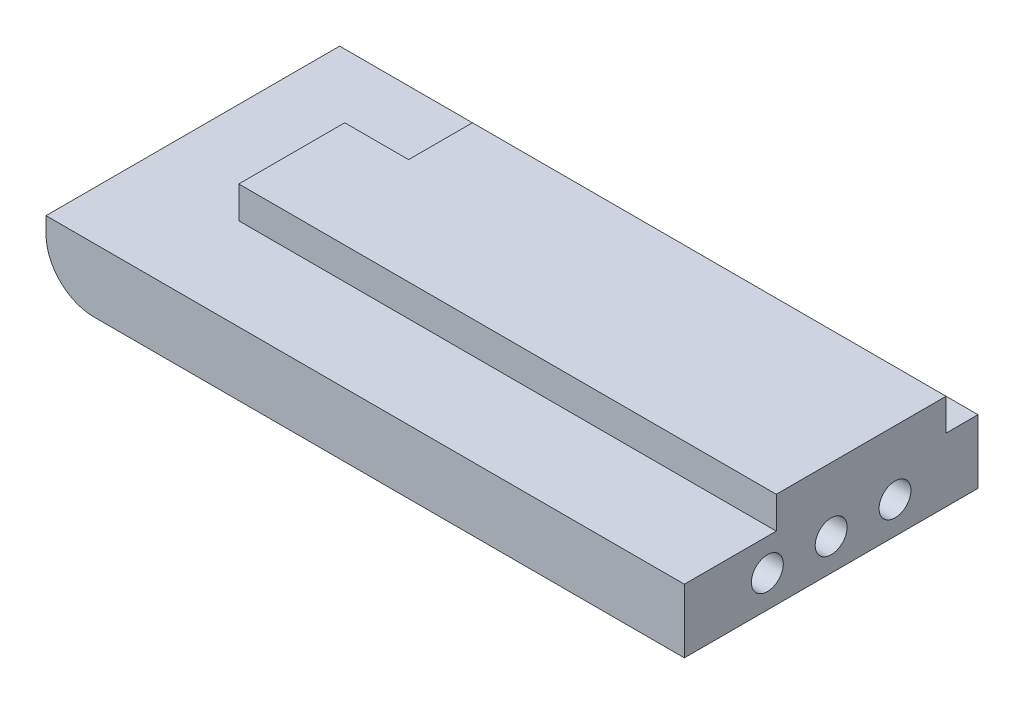
ISO-10303-21;
HEADER;
FILE_DESCRIPTION(('STEP AP214'),'2;1');
FILE_NAME('part.step','',(''),(''),'','','');
FILE_SCHEMA(('AUTOMOTIVE_DESIGN { 1 0 10303 214 1 1 1 1 }'));
ENDSEC;
DATA;
#1=APPLICATION_CONTEXT('core data for automotive mechanical design processes');
#2=APPLICATION_PROTOCOL_DEFINITION('international standard','automotive_design',2000,#1);
#3=PRODUCT_CONTEXT('',#1,'mechanical');
#4=PRODUCT('Part','Part','',(#3));
#5=PRODUCT_RELATED_PRODUCT_CATEGORY('part','',(#4));
#6=PRODUCT_DEFINITION_FORMATION('','',#4);
#7=PRODUCT_DEFINITION_CONTEXT('part definition',#1,'design');
#8=PRODUCT_DEFINITION('design','',#6,#7);
#9=PRODUCT_DEFINITION_SHAPE('','',#8);
#10=(LENGTH_UNIT() NAMED_UNIT(*) SI_UNIT(.MILLI.,.METRE.));
#11=(NAMED_UNIT(*) PLANE_ANGLE_UNIT() SI_UNIT($,.RADIAN.));
#12=(NAMED_UNIT(*) SI_UNIT($,.STERADIAN.) SOLID_ANGLE_UNIT());
#13=UNCERTAINTY_MEASURE_WITH_UNIT(LENGTH_MEASURE(1.E-05),#10,'distance_accuracy_value','');
#14=(GEOMETRIC_REPRESENTATION_CONTEXT(3) GLOBAL_UNCERTAINTY_ASSIGNED_CONTEXT((#13)) GLOBAL_UNIT_ASSIGNED_CONTEXT((#10,
#11,#12)) REPRESENTATION_CONTEXT('',''));
#15=CARTESIAN_POINT('',(0.,0.,0.));
#16=DIRECTION('',(0.,0.,1.));
#17=DIRECTION('',(1.,0.,0.));
#18=AXIS2_PLACEMENT_3D('',#15,#16,#17);
#19=CARTESIAN_POINT('',(32.766,12.7,0.));
#20=DIRECTION('',(1.,0.,0.));
#21=DIRECTION('',(0.,0.,-1.));
#22=AXIS2_PLACEMENT_3D('',#19,#20,#21);
#23=PLANE('',#22);
#24=DIRECTION('',(0.,-1.,0.));
#25=VECTOR('',#24,1.);
#26=CARTESIAN_POINT('',(32.766,43.6618005030108,-39.37));
#27=LINE('',#26,#25);
#28=CARTESIAN_POINT('',(32.766,19.05,-39.37));
#29=VERTEX_POINT('',#28);
#30=CARTESIAN_POINT('',(32.766,12.7,-39.37));
#31=VERTEX_POINT('',#30);
#32=EDGE_CURVE('E140',#29,#31,#27,.T.);
#33=ORIENTED_EDGE('',*,*,#32,.F.);
#34=DIRECTION('',(0.,0.,-1.));
#35=VECTOR('',#34,1.);
#36=CARTESIAN_POINT('',(32.766,19.05,0.));
#37=LINE('',#36,#35);
#38=CARTESIAN_POINT('',(32.766,19.05,-52.07));
#39=VERTEX_POINT('',#38);
#40=EDGE_CURVE('E130',#29,#39,#37,.T.);
#41=ORIENTED_EDGE('',*,*,#40,.T.);
#42=DIRECTION('',(0.,1.,0.));
#43=VECTOR('',#42,1.);
#44=CARTESIAN_POINT('',(32.766,12.7,-52.07));
#45=LINE('',#44,#43);
#46=CARTESIAN_POINT('',(32.766,12.7,-52.07));
#47=VERTEX_POINT('',#46);
#48=EDGE_CURVE('E195',#47,#39,#45,.T.);
#49=ORIENTED_EDGE('',*,*,#48,.F.);
#50=DIRECTION('',(0.,0.,-1.));
#51=VECTOR('',#50,1.);
#52=CARTESIAN_POINT('',(32.766,12.7,0.));
#53=LINE('',#52,#51);
#54=EDGE_CURVE('E183',#31,#47,#53,.T.);
#55=ORIENTED_EDGE('',*,*,#54,.F.);
#56=EDGE_LOOP('',(#33,#41,#49,#55));
#57=FACE_BOUND('',#56,.T.);
#58=ADVANCED_FACE('F40',(#57),#23,.F.);
#59=CARTESIAN_POINT('',(0.,12.7,0.));
#60=DIRECTION('',(0.,1.,0.));
#61=DIRECTION('',(0.,0.,1.));
#62=AXIS2_PLACEMENT_3D('',#59,#60,#61);
#63=PLANE('',#62);
#64=DIRECTION('',(-1.,0.,0.));
#65=VECTOR('',#64,1.);
#66=CARTESIAN_POINT('',(0.,12.7,-18.288));
#67=LINE('',#66,#65);
#68=CARTESIAN_POINT('',(127.,12.7,-18.288));
#69=VERTEX_POINT('',#68);
#70=CARTESIAN_POINT('',(20.066,12.7,-18.288));
#71=VERTEX_POINT('',#70);
#72=EDGE_CURVE('E55',#69,#71,#67,.T.);
#73=ORIENTED_EDGE('',*,*,#72,.T.);
#74=DIRECTION('',(0.,0.,1.));
#75=VECTOR('',#74,1.);
#76=CARTESIAN_POINT('',(20.066,12.7,-18.288));
#77=LINE('',#76,#75);
#78=CARTESIAN_POINT('',(20.066,12.7,-39.37));
#79=VERTEX_POINT('',#78);
#80=EDGE_CURVE('E60',#79,#71,#77,.T.);
#81=ORIENTED_EDGE('',*,*,#80,.F.);
#82=DIRECTION('',(-1.,0.,0.));
#83=VECTOR('',#82,1.);
#84=CARTESIAN_POINT('',(20.066,12.7,-39.37));
#85=LINE('',#84,#83);
#86=EDGE_CURVE('E146',#31,#79,#85,.T.);
#87=ORIENTED_EDGE('',*,*,#86,.F.);
#88=ORIENTED_EDGE('',*,*,#54,.T.);
#89=DIRECTION('',(-1.,0.,0.));
#90=VECTOR('',#89,1.);
#91=CARTESIAN_POINT('',(0.,12.7,-52.07));
#92=LINE('',#91,#90);
#93=CARTESIAN_POINT('',(127.,12.7,-52.07));
#94=VERTEX_POINT('',#93);
#95=EDGE_CURVE('E186',#94,#47,#92,.T.);
#96=ORIENTED_EDGE('',*,*,#95,.F.);
#97=DIRECTION('',(0.,0.,1.));
#98=VECTOR('',#97,1.);
#99=CARTESIAN_POINT('',(127.,12.7,0.));
#100=LINE('',#99,#98);
#101=CARTESIAN_POINT('',(127.,12.7,-58.42));
#102=VERTEX_POINT('',#101);
#103=EDGE_CURVE('E179',#102,#94,#100,.T.);
#104=ORIENTED_EDGE('',*,*,#103,.F.);
#105=DIRECTION('',(-1.,0.,0.));
#106=VECTOR('',#105,1.);
#107=CARTESIAN_POINT('',(0.,12.7,-58.42));
#108=LINE('',#107,#106);
#109=CARTESIAN_POINT('',(0.,12.7,-58.42));
#110=VERTEX_POINT('',#109);
#111=EDGE_CURVE('E194',#102,#110,#108,.T.);
#112=ORIENTED_EDGE('',*,*,#111,.T.);
#113=DIRECTION('',(0.,0.,1.));
#114=VECTOR('',#113,1.);
#115=CARTESIAN_POINT('',(0.,12.7,0.));
#116=LINE('',#115,#114);
#117=CARTESIAN_POINT('',(0.,12.7,0.));
#118=VERTEX_POINT('',#117);
#119=EDGE_CURVE('E189',#110,#118,#116,.T.);
#120=ORIENTED_EDGE('',*,*,#119,.T.);
#121=DIRECTION('',(1.,0.,0.));
#122=VECTOR('',#121,1.);
#123=CARTESIAN_POINT('',(0.,12.7,0.));
#124=LINE('',#123,#122);
#125=CARTESIAN_POINT('',(127.,12.7,0.));
#126=VERTEX_POINT('',#125);
#127=EDGE_CURVE('E191',#118,#126,#124,.T.);
#128=ORIENTED_EDGE('',*,*,#127,.T.);
#129=EDGE_CURVE('E177',#69,#126,#100,.T.);
#130=ORIENTED_EDGE('',*,*,#129,.F.);
#131=EDGE_LOOP('',(#73,#81,#87,#88,#96,#104,#112,#120,#128,#130));
#132=FACE_BOUND('',#131,.T.);
#133=ADVANCED_FACE('F233',(#132),#63,.T.);
#134=CARTESIAN_POINT('',(0.,19.05,0.));
#135=DIRECTION('',(1.,0.,0.));
#136=DIRECTION('',(0.,0.,-1.));
#137=AXIS2_PLACEMENT_3D('',#134,#135,#136);
#138=PLANE('',#137);
#139=DIRECTION('',(0.,-1.,0.));
#140=VECTOR('',#139,1.);
#141=CARTESIAN_POINT('',(0.,19.05,-58.42));
#142=LINE('',#141,#140);
#143=CARTESIAN_POINT('',(0.,9.525,-58.42));
#144=VERTEX_POINT('',#143);
#145=EDGE_CURVE('E207',#110,#144,#142,.T.);
#146=ORIENTED_EDGE('',*,*,#145,.T.);
#147=DIRECTION('',(0.,0.,1.));
#148=VECTOR('',#147,1.);
#149=CARTESIAN_POINT('',(0.,9.525,0.));
#150=LINE('',#149,#148);
#151=CARTESIAN_POINT('',(0.,9.525,0.));
#152=VERTEX_POINT('',#151);
#153=EDGE_CURVE('E48',#144,#152,#150,.T.);
#154=ORIENTED_EDGE('',*,*,#153,.T.);
#155=DIRECTION('',(0.,-1.,0.));
#156=VECTOR('',#155,1.);
#157=CARTESIAN_POINT('',(0.,19.05,0.));
#158=LINE('',#157,#156);
#159=EDGE_CURVE('E210',#118,#152,#158,.T.);
#160=ORIENTED_EDGE('',*,*,#159,.F.);
#161=ORIENTED_EDGE('',*,*,#119,.F.);
#162=EDGE_LOOP('',(#146,#154,#160,#161));
#163=FACE_BOUND('',#162,.T.);
#164=ADVANCED_FACE('F223',(#163),#138,.F.);
#165=CARTESIAN_POINT('',(0.,19.05,0.));
#166=DIRECTION('',(0.,0.,-1.));
#167=DIRECTION('',(-1.,0.,0.));
#168=AXIS2_PLACEMENT_3D('',#165,#166,#167);
#169=PLANE('',#168);
#170=DIRECTION('',(1.,0.,0.));
#171=VECTOR('',#170,1.);
#172=CARTESIAN_POINT('',(0.,0.,0.));
#173=LINE('',#172,#171);
#174=CARTESIAN_POINT('',(9.525,0.,0.));
#175=VERTEX_POINT('',#174);
#176=CARTESIAN_POINT('',(127.,0.,0.));
#177=VERTEX_POINT('',#176);
#178=EDGE_CURVE('E202',#175,#177,#173,.T.);
#179=ORIENTED_EDGE('',*,*,#178,.T.);
#180=DIRECTION('',(0.,-1.,0.));
#181=VECTOR('',#180,1.);
#182=CARTESIAN_POINT('',(127.,0.,0.));
#183=LINE('',#182,#181);
#184=EDGE_CURVE('E172',#126,#177,#183,.T.);
#185=ORIENTED_EDGE('',*,*,#184,.F.);
#186=ORIENTED_EDGE('',*,*,#127,.F.);
#187=ORIENTED_EDGE('',*,*,#159,.T.);
#188=CARTESIAN_POINT('',(9.525,9.525,0.));
#189=DIRECTION('',(0.,0.,-1.));
#190=DIRECTION('',(-1.,0.,0.));
#191=AXIS2_PLACEMENT_3D('',#188,#189,#190);
#192=CIRCLE('',#191,9.525);
#193=EDGE_CURVE('E218',#152,#175,#192,.F.);
#194=ORIENTED_EDGE('',*,*,#193,.T.);
#195=EDGE_LOOP('',(#179,#185,#186,#187,#194));
#196=FACE_BOUND('',#195,.T.);
#197=ADVANCED_FACE('F230',(#196),#169,.F.);
#198=CARTESIAN_POINT('',(0.,19.05,-58.42));
#199=DIRECTION('',(0.,0.,1.));
#200=DIRECTION('',(1.,0.,0.));
#201=AXIS2_PLACEMENT_3D('',#198,#199,#200);
#202=PLANE('',#201);
#203=ORIENTED_EDGE('',*,*,#111,.F.);
#204=DIRECTION('',(0.,-1.,0.));
#205=VECTOR('',#204,1.);
#206=CARTESIAN_POINT('',(127.,19.05,-58.42));
#207=LINE('',#206,#205);
#208=CARTESIAN_POINT('',(127.,0.,-58.42));
#209=VERTEX_POINT('',#208);
#210=EDGE_CURVE('E131',#102,#209,#207,.T.);
#211=ORIENTED_EDGE('',*,*,#210,.T.);
#212=DIRECTION('',(-1.,0.,0.));
#213=VECTOR('',#212,1.);
#214=CARTESIAN_POINT('',(0.,0.,-58.42));
#215=LINE('',#214,#213);
#216=CARTESIAN_POINT('',(9.525,0.,-58.42));
#217=VERTEX_POINT('',#216);
#218=EDGE_CURVE('E205',#209,#217,#215,.T.);
#219=ORIENTED_EDGE('',*,*,#218,.T.);
#220=CARTESIAN_POINT('',(9.525,9.525,-58.42));
#221=DIRECTION('',(0.,0.,1.));
#222=DIRECTION('',(1.,0.,0.));
#223=AXIS2_PLACEMENT_3D('',#220,#221,#222);
#224=CIRCLE('',#223,9.525);
#225=EDGE_CURVE('E213',#217,#144,#224,.F.);
#226=ORIENTED_EDGE('',*,*,#225,.T.);
#227=ORIENTED_EDGE('',*,*,#145,.F.);
#228=EDGE_LOOP('',(#203,#211,#219,#226,#227));
#229=FACE_BOUND('',#228,.T.);
#230=ADVANCED_FACE('F237',(#229),#202,.F.);
#231=CARTESIAN_POINT('',(0.,0.,0.));
#232=DIRECTION('',(0.,-1.,0.));
#233=DIRECTION('',(0.,0.,-1.));
#234=AXIS2_PLACEMENT_3D('',#231,#232,#233);
#235=PLANE('',#234);
#236=DIRECTION('',(0.,0.,-1.));
#237=VECTOR('',#236,1.);
#238=CARTESIAN_POINT('',(127.,0.,0.));
#239=LINE('',#238,#237);
#240=EDGE_CURVE('E155',#177,#209,#239,.T.);
#241=ORIENTED_EDGE('',*,*,#240,.F.);
#242=ORIENTED_EDGE('',*,*,#178,.F.);
#243=DIRECTION('',(0.,0.,1.));
#244=VECTOR('',#243,1.);
#245=CARTESIAN_POINT('',(9.525,0.,-58.42));
#246=LINE('',#245,#244);
#247=EDGE_CURVE('E215',#175,#217,#246,.F.);
#248=ORIENTED_EDGE('',*,*,#247,.T.);
#249=ORIENTED_EDGE('',*,*,#218,.F.);
#250=EDGE_LOOP('',(#241,#242,#248,#249));
#251=FACE_BOUND('',#250,.T.);
#252=ADVANCED_FACE('F242',(#251),#235,.T.);
#253=CARTESIAN_POINT('',(0.,12.7,-18.288));
#254=DIRECTION('',(0.,0.,-1.));
#255=DIRECTION('',(-1.,0.,0.));
#256=AXIS2_PLACEMENT_3D('',#253,#254,#255);
#257=PLANE('',#256);
#258=ORIENTED_EDGE('',*,*,#72,.F.);
#259=DIRECTION('',(0.,1.,0.));
#260=VECTOR('',#259,1.);
#261=CARTESIAN_POINT('',(127.,12.7,-18.288));
#262=LINE('',#261,#260);
#263=CARTESIAN_POINT('',(127.,19.05,-18.288));
#264=VERTEX_POINT('',#263);
#265=EDGE_CURVE('E128',#69,#264,#262,.T.);
#266=ORIENTED_EDGE('',*,*,#265,.T.);
#267=DIRECTION('',(-1.,0.,0.));
#268=VECTOR('',#267,1.);
#269=CARTESIAN_POINT('',(0.,19.05,-18.288));
#270=LINE('',#269,#268);
#271=CARTESIAN_POINT('',(20.066,19.05,-18.288));
#272=VERTEX_POINT('',#271);
#273=EDGE_CURVE('E123',#264,#272,#270,.T.);
#274=ORIENTED_EDGE('',*,*,#273,.T.);
#275=DIRECTION('',(0.,-1.,0.));
#276=VECTOR('',#275,1.);
#277=CARTESIAN_POINT('',(20.066,43.6618005030108,-18.288));
#278=LINE('',#277,#276);
#279=EDGE_CURVE('E127',#272,#71,#278,.T.);
#280=ORIENTED_EDGE('',*,*,#279,.T.);
#281=EDGE_LOOP('',(#258,#266,#274,#280));
#282=FACE_BOUND('',#281,.T.);
#283=ADVANCED_FACE('F125',(#282),#257,.F.);
#284=CARTESIAN_POINT('',(0.,12.7,-52.07));
#285=DIRECTION('',(0.,0.,-1.));
#286=DIRECTION('',(-1.,0.,0.));
#287=AXIS2_PLACEMENT_3D('',#284,#285,#286);
#288=PLANE('',#287);
#289=DIRECTION('',(0.,1.,0.));
#290=VECTOR('',#289,1.);
#291=CARTESIAN_POINT('',(127.,12.7,-52.07));
#292=LINE('',#291,#290);
#293=CARTESIAN_POINT('',(127.,19.05,-52.07));
#294=VERTEX_POINT('',#293);
#295=EDGE_CURVE('E174',#94,#294,#292,.T.);
#296=ORIENTED_EDGE('',*,*,#295,.F.);
#297=ORIENTED_EDGE('',*,*,#95,.T.);
#298=ORIENTED_EDGE('',*,*,#48,.T.);
#299=DIRECTION('',(-1.,0.,0.));
#300=VECTOR('',#299,1.);
#301=CARTESIAN_POINT('',(0.,19.05,-52.07));
#302=LINE('',#301,#300);
#303=EDGE_CURVE('E184',#294,#39,#302,.T.);
#304=ORIENTED_EDGE('',*,*,#303,.F.);
#305=EDGE_LOOP('',(#296,#297,#298,#304));
#306=FACE_BOUND('',#305,.T.);
#307=ADVANCED_FACE('F248',(#306),#288,.T.);
#308=CARTESIAN_POINT('',(0.,19.05,0.));
#309=DIRECTION('',(0.,-1.,0.));
#310=DIRECTION('',(0.,0.,-1.));
#311=AXIS2_PLACEMENT_3D('',#308,#309,#310);
#312=PLANE('',#311);
#313=ORIENTED_EDGE('',*,*,#273,.F.);
#314=DIRECTION('',(0.,0.,-1.));
#315=VECTOR('',#314,1.);
#316=CARTESIAN_POINT('',(127.,19.05,0.));
#317=LINE('',#316,#315);
#318=EDGE_CURVE('E11',#264,#294,#317,.T.);
#319=ORIENTED_EDGE('',*,*,#318,.T.);
#320=ORIENTED_EDGE('',*,*,#303,.T.);
#321=ORIENTED_EDGE('',*,*,#40,.F.);
#322=DIRECTION('',(1.,0.,0.));
#323=VECTOR('',#322,1.);
#324=CARTESIAN_POINT('',(20.066,19.05,-39.37));
#325=LINE('',#324,#323);
#326=CARTESIAN_POINT('',(20.066,19.05,-39.37));
#327=VERTEX_POINT('',#326);
#328=EDGE_CURVE('E137',#327,#29,#325,.T.);
#329=ORIENTED_EDGE('',*,*,#328,.F.);
#330=DIRECTION('',(0.,0.,-1.));
#331=VECTOR('',#330,1.);
#332=CARTESIAN_POINT('',(20.066,19.05,-18.288));
#333=LINE('',#332,#331);
#334=EDGE_CURVE('E134',#272,#327,#333,.T.);
#335=ORIENTED_EDGE('',*,*,#334,.F.);
#336=EDGE_LOOP('',(#313,#319,#320,#321,#329,#335));
#337=FACE_BOUND('',#336,.T.);
#338=ADVANCED_FACE('F135',(#337),#312,.F.);
#339=CARTESIAN_POINT('',(9.525,9.525,0.));
#340=DIRECTION('',(0.,0.,-1.));
#341=DIRECTION('',(-1.,0.,0.));
#342=AXIS2_PLACEMENT_3D('',#339,#340,#341);
#343=CYLINDRICAL_SURFACE('',#342,9.525);
#344=ORIENTED_EDGE('',*,*,#225,.F.);
#345=ORIENTED_EDGE('',*,*,#247,.F.);
#346=ORIENTED_EDGE('',*,*,#193,.F.);
#347=ORIENTED_EDGE('',*,*,#153,.F.);
#348=EDGE_LOOP('',(#344,#345,#346,#347));
#349=FACE_BOUND('',#348,.T.);
#350=ADVANCED_FACE('F42',(#349),#343,.T.);
#351=CARTESIAN_POINT('',(127.,0.,0.));
#352=DIRECTION('',(-1.,0.,0.));
#353=DIRECTION('',(0.,0.,1.));
#354=AXIS2_PLACEMENT_3D('',#351,#352,#353);
#355=PLANE('',#354);
#356=CARTESIAN_POINT('',(127.,6.35,-16.51));
#357=DIRECTION('',(1.,0.,0.));
#358=DIRECTION('',(0.,0.,-1.));
#359=AXIS2_PLACEMENT_3D('',#356,#357,#358);
#360=CIRCLE('',#359,3.175);
#361=CARTESIAN_POINT('',(127.,6.35,-19.685));
#362=VERTEX_POINT('',#361);
#363=EDGE_CURVE('E156',#362,#362,#360,.T.);
#364=ORIENTED_EDGE('',*,*,#363,.F.);
#365=EDGE_LOOP('',(#364));
#366=FACE_BOUND('',#365,.T.);
#367=CARTESIAN_POINT('',(127.,6.35,-29.21));
#368=DIRECTION('',(1.,0.,0.));
#369=DIRECTION('',(0.,0.,-1.));
#370=AXIS2_PLACEMENT_3D('',#367,#368,#369);
#371=CIRCLE('',#370,3.175);
#372=CARTESIAN_POINT('',(127.,6.35,-32.385));
#373=VERTEX_POINT('',#372);
#374=EDGE_CURVE('E162',#373,#373,#371,.T.);
#375=ORIENTED_EDGE('',*,*,#374,.F.);
#376=EDGE_LOOP('',(#375));
#377=FACE_BOUND('',#376,.T.);
#378=CARTESIAN_POINT('',(127.,6.35,-41.91));
#379=DIRECTION('',(1.,0.,0.));
#380=DIRECTION('',(0.,0.,-1.));
#381=AXIS2_PLACEMENT_3D('',#378,#379,#380);
#382=CIRCLE('',#381,3.175);
#383=CARTESIAN_POINT('',(127.,6.35,-45.085));
#384=VERTEX_POINT('',#383);
#385=EDGE_CURVE('E168',#384,#384,#382,.T.);
#386=ORIENTED_EDGE('',*,*,#385,.F.);
#387=EDGE_LOOP('',(#386));
#388=FACE_BOUND('',#387,.T.);
#389=ORIENTED_EDGE('',*,*,#103,.T.);
#390=ORIENTED_EDGE('',*,*,#295,.T.);
#391=ORIENTED_EDGE('',*,*,#318,.F.);
#392=ORIENTED_EDGE('',*,*,#265,.F.);
#393=ORIENTED_EDGE('',*,*,#129,.T.);
#394=ORIENTED_EDGE('',*,*,#184,.T.);
#395=ORIENTED_EDGE('',*,*,#240,.T.);
#396=ORIENTED_EDGE('',*,*,#210,.F.);
#397=EDGE_LOOP('',(#389,#390,#391,#392,#393,#394,#395,#396));
#398=FACE_BOUND('',#397,.T.);
#399=ADVANCED_FACE('F244',(#366,#377,#388,#398),#355,.F.);
#400=CARTESIAN_POINT('',(111.76,6.35,-41.91));
#401=DIRECTION('',(1.,0.,0.));
#402=DIRECTION('',(0.,0.,-1.));
#403=AXIS2_PLACEMENT_3D('',#400,#401,#402);
#404=CYLINDRICAL_SURFACE('',#403,3.175);
#405=CARTESIAN_POINT('',(111.76,6.35,-41.91));
#406=DIRECTION('',(1.,0.,0.));
#407=DIRECTION('',(0.,0.,-1.));
#408=AXIS2_PLACEMENT_3D('',#405,#406,#407);
#409=CIRCLE('',#408,3.175);
#410=CARTESIAN_POINT('',(111.76,6.35,-45.085));
#411=VERTEX_POINT('',#410);
#412=EDGE_CURVE('E165',#411,#411,#409,.T.);
#413=CARTESIAN_POINT('',(111.76,6.35,-45.085));
#414=CARTESIAN_POINT('',(111.91875,6.35,-45.085));
#415=CARTESIAN_POINT('',(112.0775,6.35,-45.085));
#416=CARTESIAN_POINT('',(112.395,6.35,-45.085));
#417=CARTESIAN_POINT('',(112.55375,6.35,-45.085));
#418=CARTESIAN_POINT('',(112.87125,6.35,-45.085));
#419=CARTESIAN_POINT('',(113.03,6.35,-45.085));
#420=CARTESIAN_POINT('',(113.3475,6.35,-45.085));
#421=CARTESIAN_POINT('',(113.50625,6.35,-45.085));
#422=CARTESIAN_POINT('',(113.82375,6.35,-45.085));
#423=CARTESIAN_POINT('',(113.9825,6.35,-45.085));
#424=CARTESIAN_POINT('',(114.3,6.35,-45.085));
#425=CARTESIAN_POINT('',(114.45875,6.35,-45.085));
#426=CARTESIAN_POINT('',(114.77625,6.35,-45.085));
#427=CARTESIAN_POINT('',(114.935,6.35,-45.085));
#428=CARTESIAN_POINT('',(115.2525,6.35,-45.085));
#429=CARTESIAN_POINT('',(115.41125,6.35,-45.085));
#430=CARTESIAN_POINT('',(115.72875,6.35,-45.085));
#431=CARTESIAN_POINT('',(115.8875,6.35,-45.085));
#432=CARTESIAN_POINT('',(116.205,6.35,-45.085));
#433=CARTESIAN_POINT('',(116.36375,6.35,-45.085));
#434=CARTESIAN_POINT('',(116.68125,6.35,-45.085));
#435=CARTESIAN_POINT('',(116.84,6.35,-45.085));
#436=CARTESIAN_POINT('',(117.1575,6.35,-45.085));
#437=CARTESIAN_POINT('',(117.31625,6.35,-45.085));
#438=CARTESIAN_POINT('',(117.63375,6.35,-45.085));
#439=CARTESIAN_POINT('',(117.7925,6.35,-45.085));
#440=CARTESIAN_POINT('',(118.11,6.35,-45.085));
#441=CARTESIAN_POINT('',(118.26875,6.35,-45.085));
#442=CARTESIAN_POINT('',(118.58625,6.35,-45.085));
#443=CARTESIAN_POINT('',(118.745,6.35,-45.085));
#444=CARTESIAN_POINT('',(119.0625,6.35,-45.085));
#445=CARTESIAN_POINT('',(119.22125,6.35,-45.085));
#446=CARTESIAN_POINT('',(119.53875,6.35,-45.085));
#447=CARTESIAN_POINT('',(119.6975,6.35,-45.085));
#448=CARTESIAN_POINT('',(120.015,6.35,-45.085));
#449=CARTESIAN_POINT('',(120.17375,6.35,-45.085));
#450=CARTESIAN_POINT('',(120.49125,6.35,-45.085));
#451=CARTESIAN_POINT('',(120.65,6.35,-45.085));
#452=CARTESIAN_POINT('',(120.9675,6.35,-45.085));
#453=CARTESIAN_POINT('',(121.12625,6.35,-45.085));
#454=CARTESIAN_POINT('',(121.44375,6.35,-45.085));
#455=CARTESIAN_POINT('',(121.6025,6.35,-45.085));
#456=CARTESIAN_POINT('',(121.92,6.35,-45.085));
#457=CARTESIAN_POINT('',(122.07875,6.35,-45.085));
#458=CARTESIAN_POINT('',(122.39625,6.35,-45.085));
#459=CARTESIAN_POINT('',(122.555,6.35,-45.085));
#460=CARTESIAN_POINT('',(122.8725,6.35,-45.085));
#461=CARTESIAN_POINT('',(123.03125,6.35,-45.085));
#462=CARTESIAN_POINT('',(123.34875,6.35,-45.085));
#463=CARTESIAN_POINT('',(123.5075,6.35,-45.085));
#464=CARTESIAN_POINT('',(123.825,6.35,-45.085));
#465=CARTESIAN_POINT('',(123.98375,6.35,-45.085));
#466=CARTESIAN_POINT('',(124.30125,6.35,-45.085));
#467=CARTESIAN_POINT('',(124.46,6.35,-45.085));
#468=CARTESIAN_POINT('',(124.7775,6.35,-45.085));
#469=CARTESIAN_POINT('',(124.93625,6.35,-45.085));
#470=CARTESIAN_POINT('',(125.25375,6.35,-45.085));
#471=CARTESIAN_POINT('',(125.4125,6.35,-45.085));
#472=CARTESIAN_POINT('',(125.73,6.35,-45.085));
#473=CARTESIAN_POINT('',(125.88875,6.35,-45.085));
#474=CARTESIAN_POINT('',(126.20625,6.35,-45.085));
#475=CARTESIAN_POINT('',(126.365,6.35,-45.085));
#476=CARTESIAN_POINT('',(126.6825,6.35,-45.085));
#477=CARTESIAN_POINT('',(126.84125,6.35,-45.085));
#478=CARTESIAN_POINT('',(127.,6.35,-45.085));
#479=B_SPLINE_CURVE_WITH_KNOTS('',3,(#413,#414,#415,#416,#417,#418,#419,#420,#421,#422,#423,
#424,#425,#426,#427,#428,#429,#430,#431,#432,#433,#434,#435,#436,#437,#438,#439,#440,#441,#442,
#443,#444,#445,#446,#447,#448,#449,#450,#451,#452,#453,#454,#455,#456,#457,#458,#459,#460,#461,
#462,#463,#464,#465,#466,#467,#468,#469,#470,#471,#472,#473,#474,#475,#476,#477,#478),
.UNSPECIFIED.,.F.,.F.,(4,2,2,2,2,2,2,2,2,2,2,2,2,2,2,2,2,2,2,2,2,2,2,2,2,2,2,2,2,2,2,2,4),(0.,
0.476249999999998,0.952499999999995,1.42874999999999,1.90499999999999,2.38124999999999,
2.85749999999998,3.33375,3.80999999999999,4.28624999999999,4.76249999999999,5.23874999999999,
5.715,6.19125,6.66749999999999,7.14374999999999,7.61999999999999,8.09624999999999,
8.57249999999998,9.04874999999999,9.52499999999999,10.00125,10.4775,10.95375,11.43,11.90625,
12.3825,12.85875,13.335,13.81125,14.2875,14.76375,15.24),.UNSPECIFIED.);
#480=EDGE_CURVE('BSEAM325',#411,#384,#479,.T.);
#481=ORIENTED_EDGE('',*,*,#412,.F.);
#482=ORIENTED_EDGE('',*,*,#385,.T.);
#483=ORIENTED_EDGE('',*,*,#480,.T.);
#484=ORIENTED_EDGE('',*,*,#480,.F.);
#485=EDGE_LOOP('',(#481,#483,#482,#484));
#486=FACE_BOUND('',#485,.T.);
#487=ADVANCED_FACE('F325',(#486),#404,.F.);
#488=CARTESIAN_POINT('',(111.76,6.35,-41.91));
#489=DIRECTION('',(1.,0.,0.));
#490=DIRECTION('',(0.,0.,-1.));
#491=AXIS2_PLACEMENT_3D('',#488,#489,#490);
#492=PLANE('',#491);
#493=ORIENTED_EDGE('',*,*,#412,.T.);
#494=EDGE_LOOP('',(#493));
#495=FACE_BOUND('',#494,.T.);
#496=ADVANCED_FACE('F333',(#495),#492,.T.);
#497=CARTESIAN_POINT('',(111.76,6.35,-29.21));
#498=DIRECTION('',(1.,0.,0.));
#499=DIRECTION('',(0.,0.,-1.));
#500=AXIS2_PLACEMENT_3D('',#497,#498,#499);
#501=CYLINDRICAL_SURFACE('',#500,3.175);
#502=CARTESIAN_POINT('',(111.76,6.35,-29.21));
#503=DIRECTION('',(1.,0.,0.));
#504=DIRECTION('',(0.,0.,-1.));
#505=AXIS2_PLACEMENT_3D('',#502,#503,#504);
#506=CIRCLE('',#505,3.175);
#507=CARTESIAN_POINT('',(111.76,6.35,-32.385));
#508=VERTEX_POINT('',#507);
#509=EDGE_CURVE('E159',#508,#508,#506,.T.);
#510=CARTESIAN_POINT('',(111.76,6.35,-32.385));
#511=CARTESIAN_POINT('',(111.91875,6.35,-32.385));
#512=CARTESIAN_POINT('',(112.0775,6.35,-32.385));
#513=CARTESIAN_POINT('',(112.395,6.35,-32.385));
#514=CARTESIAN_POINT('',(112.55375,6.35,-32.385));
#515=CARTESIAN_POINT('',(112.87125,6.35,-32.385));
#516=CARTESIAN_POINT('',(113.03,6.35,-32.385));
#517=CARTESIAN_POINT('',(113.3475,6.35,-32.385));
#518=CARTESIAN_POINT('',(113.50625,6.35,-32.385));
#519=CARTESIAN_POINT('',(113.82375,6.35,-32.385));
#520=CARTESIAN_POINT('',(113.9825,6.35,-32.385));
#521=CARTESIAN_POINT('',(114.3,6.35,-32.385));
#522=CARTESIAN_POINT('',(114.45875,6.35,-32.385));
#523=CARTESIAN_POINT('',(114.77625,6.35,-32.385));
#524=CARTESIAN_POINT('',(114.935,6.35,-32.385));
#525=CARTESIAN_POINT('',(115.2525,6.35,-32.385));
#526=CARTESIAN_POINT('',(115.41125,6.35,-32.385));
#527=CARTESIAN_POINT('',(115.72875,6.35,-32.385));
#528=CARTESIAN_POINT('',(115.8875,6.35,-32.385));
#529=CARTESIAN_POINT('',(116.205,6.35,-32.385));
#530=CARTESIAN_POINT('',(116.36375,6.35,-32.385));
#531=CARTESIAN_POINT('',(116.68125,6.35,-32.385));
#532=CARTESIAN_POINT('',(116.84,6.35,-32.385));
#533=CARTESIAN_POINT('',(117.1575,6.35,-32.385));
#534=CARTESIAN_POINT('',(117.31625,6.35,-32.385));
#535=CARTESIAN_POINT('',(117.63375,6.35,-32.385));
#536=CARTESIAN_POINT('',(117.7925,6.35,-32.385));
#537=CARTESIAN_POINT('',(118.11,6.35,-32.385));
#538=CARTESIAN_POINT('',(118.26875,6.35,-32.385));
#539=CARTESIAN_POINT('',(118.58625,6.35,-32.385));
#540=CARTESIAN_POINT('',(118.745,6.35,-32.385));
#541=CARTESIAN_POINT('',(119.0625,6.35,-32.385));
#542=CARTESIAN_POINT('',(119.22125,6.35,-32.385));
#543=CARTESIAN_POINT('',(119.53875,6.35,-32.385));
#544=CARTESIAN_POINT('',(119.6975,6.35,-32.385));
#545=CARTESIAN_POINT('',(120.015,6.35,-32.385));
#546=CARTESIAN_POINT('',(120.17375,6.35,-32.385));
#547=CARTESIAN_POINT('',(120.49125,6.35,-32.385));
#548=CARTESIAN_POINT('',(120.65,6.35,-32.385));
#549=CARTESIAN_POINT('',(120.9675,6.35,-32.385));
#550=CARTESIAN_POINT('',(121.12625,6.35,-32.385));
#551=CARTESIAN_POINT('',(121.44375,6.35,-32.385));
#552=CARTESIAN_POINT('',(121.6025,6.35,-32.385));
#553=CARTESIAN_POINT('',(121.92,6.35,-32.385));
#554=CARTESIAN_POINT('',(122.07875,6.35,-32.385));
#555=CARTESIAN_POINT('',(122.39625,6.35,-32.385));
#556=CARTESIAN_POINT('',(122.555,6.35,-32.385));
#557=CARTESIAN_POINT('',(122.8725,6.35,-32.385));
#558=CARTESIAN_POINT('',(123.03125,6.35,-32.385));
#559=CARTESIAN_POINT('',(123.34875,6.35,-32.385));
#560=CARTESIAN_POINT('',(123.5075,6.35,-32.385));
#561=CARTESIAN_POINT('',(123.825,6.35,-32.385));
#562=CARTESIAN_POINT('',(123.98375,6.35,-32.385));
#563=CARTESIAN_POINT('',(124.30125,6.35,-32.385));
#564=CARTESIAN_POINT('',(124.46,6.35,-32.385));
#565=CARTESIAN_POINT('',(124.7775,6.35,-32.385));
#566=CARTESIAN_POINT('',(124.93625,6.35,-32.385));
#567=CARTESIAN_POINT('',(125.25375,6.35,-32.385));
#568=CARTESIAN_POINT('',(125.4125,6.35,-32.385));
#569=CARTESIAN_POINT('',(125.73,6.35,-32.385));
#570=CARTESIAN_POINT('',(125.88875,6.35,-32.385));
#571=CARTESIAN_POINT('',(126.20625,6.35,-32.385));
#572=CARTESIAN_POINT('',(126.365,6.35,-32.385));
#573=CARTESIAN_POINT('',(126.6825,6.35,-32.385));
#574=CARTESIAN_POINT('',(126.84125,6.35,-32.385));
#575=CARTESIAN_POINT('',(127.,6.35,-32.385));
#576=B_SPLINE_CURVE_WITH_KNOTS('',3,(#510,#511,#512,#513,#514,#515,#516,#517,#518,#519,#520,
#521,#522,#523,#524,#525,#526,#527,#528,#529,#530,#531,#532,#533,#534,#535,#536,#537,#538,#539,
#540,#541,#542,#543,#544,#545,#546,#547,#548,#549,#550,#551,#552,#553,#554,#555,#556,#557,#558,
#559,#560,#561,#562,#563,#564,#565,#566,#567,#568,#569,#570,#571,#572,#573,#574,#575),
.UNSPECIFIED.,.F.,.F.,(4,2,2,2,2,2,2,2,2,2,2,2,2,2,2,2,2,2,2,2,2,2,2,2,2,2,2,2,2,2,2,2,4),(0.,
0.476249999999998,0.952499999999995,1.42874999999999,1.90499999999999,2.38124999999999,
2.85749999999998,3.33375,3.80999999999999,4.28624999999999,4.76249999999999,5.23874999999999,
5.715,6.19125,6.66749999999999,7.14374999999999,7.61999999999999,8.09624999999999,
8.57249999999998,9.04874999999999,9.52499999999999,10.00125,10.4775,10.95375,11.43,11.90625,
12.3825,12.85875,13.335,13.81125,14.2875,14.76375,15.24),.UNSPECIFIED.);
#577=EDGE_CURVE('BSEAM341',#508,#373,#576,.T.);
#578=ORIENTED_EDGE('',*,*,#509,.F.);
#579=ORIENTED_EDGE('',*,*,#374,.T.);
#580=ORIENTED_EDGE('',*,*,#577,.T.);
#581=ORIENTED_EDGE('',*,*,#577,.F.);
#582=EDGE_LOOP('',(#578,#580,#579,#581));
#583=FACE_BOUND('',#582,.T.);
#584=ADVANCED_FACE('F341',(#583),#501,.F.);
#585=CARTESIAN_POINT('',(111.76,6.35,-29.21));
#586=DIRECTION('',(1.,0.,0.));
#587=DIRECTION('',(0.,0.,-1.));
#588=AXIS2_PLACEMENT_3D('',#585,#586,#587);
#589=PLANE('',#588);
#590=ORIENTED_EDGE('',*,*,#509,.T.);
#591=EDGE_LOOP('',(#590));
#592=FACE_BOUND('',#591,.T.);
#593=ADVANCED_FACE('F349',(#592),#589,.T.);
#594=CARTESIAN_POINT('',(111.76,6.35,-16.51));
#595=DIRECTION('',(1.,0.,0.));
#596=DIRECTION('',(0.,0.,-1.));
#597=AXIS2_PLACEMENT_3D('',#594,#595,#596);
#598=CYLINDRICAL_SURFACE('',#597,3.175);
#599=CARTESIAN_POINT('',(111.76,6.35,-16.51));
#600=DIRECTION('',(1.,0.,0.));
#601=DIRECTION('',(0.,0.,-1.));
#602=AXIS2_PLACEMENT_3D('',#599,#600,#601);
#603=CIRCLE('',#602,3.175);
#604=CARTESIAN_POINT('',(111.76,6.35,-19.685));
#605=VERTEX_POINT('',#604);
#606=EDGE_CURVE('E152',#605,#605,#603,.T.);
#607=CARTESIAN_POINT('',(111.76,6.35,-19.685));
#608=CARTESIAN_POINT('',(111.91875,6.35,-19.685));
#609=CARTESIAN_POINT('',(112.0775,6.35,-19.685));
#610=CARTESIAN_POINT('',(112.395,6.35,-19.685));
#611=CARTESIAN_POINT('',(112.55375,6.35,-19.685));
#612=CARTESIAN_POINT('',(112.87125,6.35,-19.685));
#613=CARTESIAN_POINT('',(113.03,6.35,-19.685));
#614=CARTESIAN_POINT('',(113.3475,6.35,-19.685));
#615=CARTESIAN_POINT('',(113.50625,6.35,-19.685));
#616=CARTESIAN_POINT('',(113.82375,6.35,-19.685));
#617=CARTESIAN_POINT('',(113.9825,6.35,-19.685));
#618=CARTESIAN_POINT('',(114.3,6.35,-19.685));
#619=CARTESIAN_POINT('',(114.45875,6.35,-19.685));
#620=CARTESIAN_POINT('',(114.77625,6.35,-19.685));
#621=CARTESIAN_POINT('',(114.935,6.35,-19.685));
#622=CARTESIAN_POINT('',(115.2525,6.35,-19.685));
#623=CARTESIAN_POINT('',(115.41125,6.35,-19.685));
#624=CARTESIAN_POINT('',(115.72875,6.35,-19.685));
#625=CARTESIAN_POINT('',(115.8875,6.35,-19.685));
#626=CARTESIAN_POINT('',(116.205,6.35,-19.685));
#627=CARTESIAN_POINT('',(116.36375,6.35,-19.685));
#628=CARTESIAN_POINT('',(116.68125,6.35,-19.685));
#629=CARTESIAN_POINT('',(116.84,6.35,-19.685));
#630=CARTESIAN_POINT('',(117.1575,6.35,-19.685));
#631=CARTESIAN_POINT('',(117.31625,6.35,-19.685));
#632=CARTESIAN_POINT('',(117.63375,6.35,-19.685));
#633=CARTESIAN_POINT('',(117.7925,6.35,-19.685));
#634=CARTESIAN_POINT('',(118.11,6.35,-19.685));
#635=CARTESIAN_POINT('',(118.26875,6.35,-19.685));
#636=CARTESIAN_POINT('',(118.58625,6.35,-19.685));
#637=CARTESIAN_POINT('',(118.745,6.35,-19.685));
#638=CARTESIAN_POINT('',(119.0625,6.35,-19.685));
#639=CARTESIAN_POINT('',(119.22125,6.35,-19.685));
#640=CARTESIAN_POINT('',(119.53875,6.35,-19.685));
#641=CARTESIAN_POINT('',(119.6975,6.35,-19.685));
#642=CARTESIAN_POINT('',(120.015,6.35,-19.685));
#643=CARTESIAN_POINT('',(120.17375,6.35,-19.685));
#644=CARTESIAN_POINT('',(120.49125,6.35,-19.685));
#645=CARTESIAN_POINT('',(120.65,6.35,-19.685));
#646=CARTESIAN_POINT('',(120.9675,6.35,-19.685));
#647=CARTESIAN_POINT('',(121.12625,6.35,-19.685));
#648=CARTESIAN_POINT('',(121.44375,6.35,-19.685));
#649=CARTESIAN_POINT('',(121.6025,6.35,-19.685));
#650=CARTESIAN_POINT('',(121.92,6.35,-19.685));
#651=CARTESIAN_POINT('',(122.07875,6.35,-19.685));
#652=CARTESIAN_POINT('',(122.39625,6.35,-19.685));
#653=CARTESIAN_POINT('',(122.555,6.35,-19.685));
#654=CARTESIAN_POINT('',(122.8725,6.35,-19.685));
#655=CARTESIAN_POINT('',(123.03125,6.35,-19.685));
#656=CARTESIAN_POINT('',(123.34875,6.35,-19.685));
#657=CARTESIAN_POINT('',(123.5075,6.35,-19.685));
#658=CARTESIAN_POINT('',(123.825,6.35,-19.685));
#659=CARTESIAN_POINT('',(123.98375,6.35,-19.685));
#660=CARTESIAN_POINT('',(124.30125,6.35,-19.685));
#661=CARTESIAN_POINT('',(124.46,6.35,-19.685));
#662=CARTESIAN_POINT('',(124.7775,6.35,-19.685));
#663=CARTESIAN_POINT('',(124.93625,6.35,-19.685));
#664=CARTESIAN_POINT('',(125.25375,6.35,-19.685));
#665=CARTESIAN_POINT('',(125.4125,6.35,-19.685));
#666=CARTESIAN_POINT('',(125.73,6.35,-19.685));
#667=CARTESIAN_POINT('',(125.88875,6.35,-19.685));
#668=CARTESIAN_POINT('',(126.20625,6.35,-19.685));
#669=CARTESIAN_POINT('',(126.365,6.35,-19.685));
#670=CARTESIAN_POINT('',(126.6825,6.35,-19.685));
#671=CARTESIAN_POINT('',(126.84125,6.35,-19.685));
#672=CARTESIAN_POINT('',(127.,6.35,-19.685));
#673=B_SPLINE_CURVE_WITH_KNOTS('',3,(#607,#608,#609,#610,#611,#612,#613,#614,#615,#616,#617,
#618,#619,#620,#621,#622,#623,#624,#625,#626,#627,#628,#629,#630,#631,#632,#633,#634,#635,#636,
#637,#638,#639,#640,#641,#642,#643,#644,#645,#646,#647,#648,#649,#650,#651,#652,#653,#654,#655,
#656,#657,#658,#659,#660,#661,#662,#663,#664,#665,#666,#667,#668,#669,#670,#671,#672),
.UNSPECIFIED.,.F.,.F.,(4,2,2,2,2,2,2,2,2,2,2,2,2,2,2,2,2,2,2,2,2,2,2,2,2,2,2,2,2,2,2,2,4),(0.,
0.476249999999998,0.952499999999995,1.42874999999999,1.90499999999999,2.38124999999999,
2.85749999999998,3.33375,3.80999999999999,4.28624999999999,4.76249999999999,5.23874999999999,
5.715,6.19125,6.66749999999999,7.14374999999999,7.61999999999999,8.09624999999999,
8.57249999999998,9.04874999999999,9.52499999999999,10.00125,10.4775,10.95375,11.43,11.90625,
12.3825,12.85875,13.335,13.81125,14.2875,14.76375,15.24),.UNSPECIFIED.);
#674=EDGE_CURVE('BSEAM357',#605,#362,#673,.T.);
#675=ORIENTED_EDGE('',*,*,#606,.F.);
#676=ORIENTED_EDGE('',*,*,#363,.T.);
#677=ORIENTED_EDGE('',*,*,#674,.T.);
#678=ORIENTED_EDGE('',*,*,#674,.F.);
#679=EDGE_LOOP('',(#675,#677,#676,#678));
#680=FACE_BOUND('',#679,.T.);
#681=ADVANCED_FACE('F357',(#680),#598,.F.);
#682=CARTESIAN_POINT('',(111.76,6.35,-16.51));
#683=DIRECTION('',(1.,0.,0.));
#684=DIRECTION('',(0.,0.,-1.));
#685=AXIS2_PLACEMENT_3D('',#682,#683,#684);
#686=PLANE('',#685);
#687=ORIENTED_EDGE('',*,*,#606,.T.);
#688=EDGE_LOOP('',(#687));
#689=FACE_BOUND('',#688,.T.);
#690=ADVANCED_FACE('F263',(#689),#686,.T.);
#691=CARTESIAN_POINT('',(20.066,43.6618005030108,-18.288));
#692=DIRECTION('',(1.,0.,0.));
#693=DIRECTION('',(0.,0.,-1.));
#694=AXIS2_PLACEMENT_3D('',#691,#692,#693);
#695=PLANE('',#694);
#696=ORIENTED_EDGE('',*,*,#279,.F.);
#697=ORIENTED_EDGE('',*,*,#334,.T.);
#698=DIRECTION('',(0.,-1.,0.));
#699=VECTOR('',#698,1.);
#700=CARTESIAN_POINT('',(20.066,43.6618005030108,-39.37));
#701=LINE('',#700,#699);
#702=EDGE_CURVE('E143',#327,#79,#701,.T.);
#703=ORIENTED_EDGE('',*,*,#702,.T.);
#704=ORIENTED_EDGE('',*,*,#80,.T.);
#705=EDGE_LOOP('',(#696,#697,#703,#704));
#706=FACE_BOUND('',#705,.T.);
#707=ADVANCED_FACE('F142',(#706),#695,.F.);
#708=CARTESIAN_POINT('',(20.066,43.6618005030108,-39.37));
#709=DIRECTION('',(0.,0.,1.));
#710=DIRECTION('',(1.,0.,0.));
#711=AXIS2_PLACEMENT_3D('',#708,#709,#710);
#712=PLANE('',#711);
#713=ORIENTED_EDGE('',*,*,#702,.F.);
#714=ORIENTED_EDGE('',*,*,#328,.T.);
#715=ORIENTED_EDGE('',*,*,#32,.T.);
#716=ORIENTED_EDGE('',*,*,#86,.T.);
#717=EDGE_LOOP('',(#713,#714,#715,#716));
#718=FACE_BOUND('',#717,.T.);
#719=ADVANCED_FACE('F256',(#718),#712,.F.);
#720=CLOSED_SHELL('',(#58,#133,#164,#197,#230,#252,#283,#307,#338,#350,#399,#487,#496,#584,#593,
#681,#690,#707,#719));
#721=MANIFOLD_SOLID_BREP('B2',#720);
#722=ADVANCED_BREP_SHAPE_REPRESENTATION('',(#18,#721),#14);
#723=SHAPE_DEFINITION_REPRESENTATION(#9,#722);
ENDSEC;
END-ISO-10303-21;
